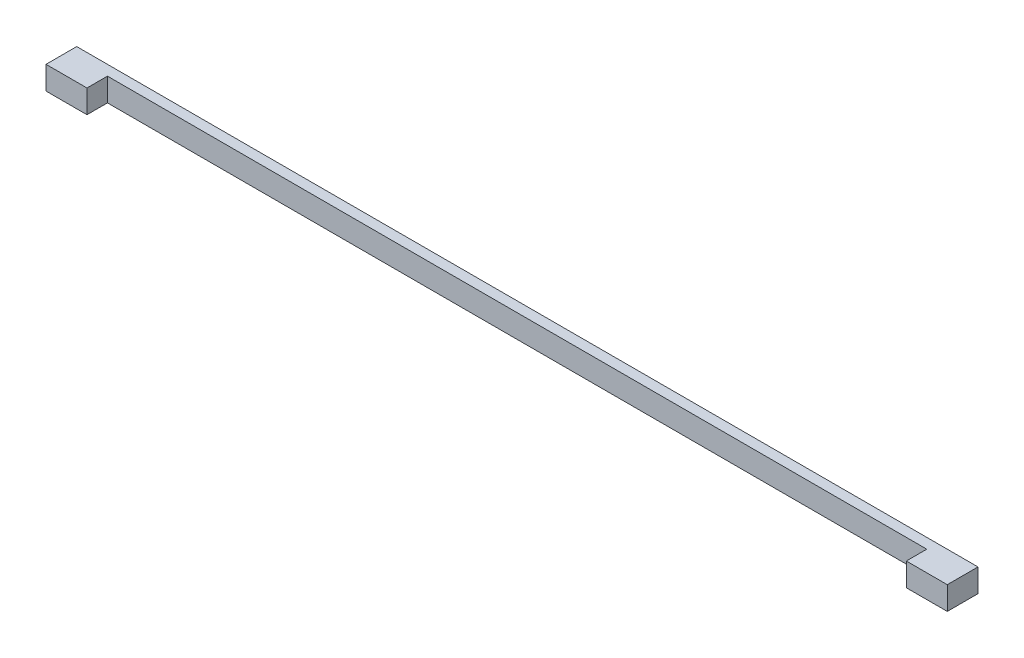
ISO-10303-21;
HEADER;
FILE_DESCRIPTION(('STEP AP214'),'2;1');
FILE_NAME('part.step','',(''),(''),'','','');
FILE_SCHEMA(('AUTOMOTIVE_DESIGN { 1 0 10303 214 1 1 1 1 }'));
ENDSEC;
DATA;
#1=APPLICATION_CONTEXT('core data for automotive mechanical design processes');
#2=APPLICATION_PROTOCOL_DEFINITION('international standard','automotive_design',2000,#1);
#3=PRODUCT_CONTEXT('',#1,'mechanical');
#4=PRODUCT('Part','Part','',(#3));
#5=PRODUCT_RELATED_PRODUCT_CATEGORY('part','',(#4));
#6=PRODUCT_DEFINITION_FORMATION('','',#4);
#7=PRODUCT_DEFINITION_CONTEXT('part definition',#1,'design');
#8=PRODUCT_DEFINITION('design','',#6,#7);
#9=PRODUCT_DEFINITION_SHAPE('','',#8);
#10=(LENGTH_UNIT() NAMED_UNIT(*) SI_UNIT(.MILLI.,.METRE.));
#11=(NAMED_UNIT(*) PLANE_ANGLE_UNIT() SI_UNIT($,.RADIAN.));
#12=(NAMED_UNIT(*) SI_UNIT($,.STERADIAN.) SOLID_ANGLE_UNIT());
#13=UNCERTAINTY_MEASURE_WITH_UNIT(LENGTH_MEASURE(1.E-05),#10,'distance_accuracy_value','');
#14=(GEOMETRIC_REPRESENTATION_CONTEXT(3) GLOBAL_UNCERTAINTY_ASSIGNED_CONTEXT((#13)) GLOBAL_UNIT_ASSIGNED_CONTEXT((#10,
#11,#12)) REPRESENTATION_CONTEXT('',''));
#15=CARTESIAN_POINT('',(0.,0.,0.));
#16=DIRECTION('',(0.,0.,1.));
#17=DIRECTION('',(1.,0.,0.));
#18=AXIS2_PLACEMENT_3D('',#15,#16,#17);
#19=CARTESIAN_POINT('',(0.,0.,5.));
#20=DIRECTION('',(0.,0.,1.));
#21=DIRECTION('',(1.,0.,0.));
#22=AXIS2_PLACEMENT_3D('',#19,#20,#21);
#23=PLANE('',#22);
#24=DIRECTION('',(1.,0.,0.));
#25=VECTOR('',#24,1.);
#26=CARTESIAN_POINT('',(-220.,-5.66011176625891,5.));
#27=LINE('',#26,#25);
#28=CARTESIAN_POINT('',(-200.,-5.66011176625891,5.));
#29=VERTEX_POINT('',#28);
#30=CARTESIAN_POINT('',(200.,-5.66011176625891,5.));
#31=VERTEX_POINT('',#30);
#32=EDGE_CURVE('E64',#29,#31,#27,.T.);
#33=ORIENTED_EDGE('',*,*,#32,.T.);
#34=DIRECTION('',(0.,-1.,0.));
#35=VECTOR('',#34,1.);
#36=CARTESIAN_POINT('',(200.,5.66011176625891,5.));
#37=LINE('',#36,#35);
#38=CARTESIAN_POINT('',(200.,5.66011176625891,5.));
#39=VERTEX_POINT('',#38);
#40=EDGE_CURVE('E59',#39,#31,#37,.T.);
#41=ORIENTED_EDGE('',*,*,#40,.F.);
#42=DIRECTION('',(-1.,0.,0.));
#43=VECTOR('',#42,1.);
#44=CARTESIAN_POINT('',(-220.,5.66011176625891,5.));
#45=LINE('',#44,#43);
#46=CARTESIAN_POINT('',(-200.,5.66011176625891,5.));
#47=VERTEX_POINT('',#46);
#48=EDGE_CURVE('E169',#39,#47,#45,.T.);
#49=ORIENTED_EDGE('',*,*,#48,.T.);
#50=DIRECTION('',(0.,1.,0.));
#51=VECTOR('',#50,1.);
#52=CARTESIAN_POINT('',(-200.,-5.66011176625891,5.));
#53=LINE('',#52,#51);
#54=EDGE_CURVE('E138',#29,#47,#53,.T.);
#55=ORIENTED_EDGE('',*,*,#54,.F.);
#56=EDGE_LOOP('',(#33,#41,#49,#55));
#57=FACE_BOUND('',#56,.T.);
#58=ADVANCED_FACE('F43',(#57),#23,.T.);
#59=CARTESIAN_POINT('',(220.,5.66011176625891,5.));
#60=DIRECTION('',(-1.,0.,0.));
#61=DIRECTION('',(0.,0.,1.));
#62=AXIS2_PLACEMENT_3D('',#59,#60,#61);
#63=PLANE('',#62);
#64=DIRECTION('',(0.,1.,0.));
#65=VECTOR('',#64,1.);
#66=CARTESIAN_POINT('',(220.,5.66011176625891,0.));
#67=LINE('',#66,#65);
#68=CARTESIAN_POINT('',(220.,-5.66011176625891,0.));
#69=VERTEX_POINT('',#68);
#70=CARTESIAN_POINT('',(220.,5.66011176625891,0.));
#71=VERTEX_POINT('',#70);
#72=EDGE_CURVE('E168',#69,#71,#67,.T.);
#73=ORIENTED_EDGE('',*,*,#72,.T.);
#74=DIRECTION('',(0.,0.,-1.));
#75=VECTOR('',#74,1.);
#76=CARTESIAN_POINT('',(220.,5.66011176625891,5.));
#77=LINE('',#76,#75);
#78=CARTESIAN_POINT('',(220.,5.66011176625891,15.));
#79=VERTEX_POINT('',#78);
#80=EDGE_CURVE('E11',#79,#71,#77,.T.);
#81=ORIENTED_EDGE('',*,*,#80,.F.);
#82=DIRECTION('',(0.,1.,0.));
#83=VECTOR('',#82,1.);
#84=CARTESIAN_POINT('',(220.,5.66011176625891,15.));
#85=LINE('',#84,#83);
#86=CARTESIAN_POINT('',(220.,-5.66011176625891,15.));
#87=VERTEX_POINT('',#86);
#88=EDGE_CURVE('E125',#87,#79,#85,.T.);
#89=ORIENTED_EDGE('',*,*,#88,.F.);
#90=DIRECTION('',(0.,0.,-1.));
#91=VECTOR('',#90,1.);
#92=CARTESIAN_POINT('',(220.,-5.66011176625891,5.));
#93=LINE('',#92,#91);
#94=EDGE_CURVE('E107',#87,#69,#93,.T.);
#95=ORIENTED_EDGE('',*,*,#94,.T.);
#96=EDGE_LOOP('',(#73,#81,#89,#95));
#97=FACE_BOUND('',#96,.T.);
#98=ADVANCED_FACE('F45',(#97),#63,.F.);
#99=CARTESIAN_POINT('',(-220.,5.66011176625891,5.));
#100=DIRECTION('',(0.,-1.,0.));
#101=DIRECTION('',(0.,0.,-1.));
#102=AXIS2_PLACEMENT_3D('',#99,#100,#101);
#103=PLANE('',#102);
#104=DIRECTION('',(-1.,0.,0.));
#105=VECTOR('',#104,1.);
#106=CARTESIAN_POINT('',(-220.,5.66011176625891,0.));
#107=LINE('',#106,#105);
#108=CARTESIAN_POINT('',(-220.,5.66011176625891,0.));
#109=VERTEX_POINT('',#108);
#110=EDGE_CURVE('E176',#71,#109,#107,.T.);
#111=ORIENTED_EDGE('',*,*,#110,.T.);
#112=DIRECTION('',(0.,0.,-1.));
#113=VECTOR('',#112,1.);
#114=CARTESIAN_POINT('',(-220.,5.66011176625891,5.));
#115=LINE('',#114,#113);
#116=CARTESIAN_POINT('',(-220.,5.66011176625891,15.));
#117=VERTEX_POINT('',#116);
#118=EDGE_CURVE('E52',#117,#109,#115,.T.);
#119=ORIENTED_EDGE('',*,*,#118,.F.);
#120=DIRECTION('',(-1.,0.,0.));
#121=VECTOR('',#120,1.);
#122=CARTESIAN_POINT('',(-220.,5.66011176625891,15.));
#123=LINE('',#122,#121);
#124=CARTESIAN_POINT('',(-200.,5.66011176625891,15.));
#125=VERTEX_POINT('',#124);
#126=EDGE_CURVE('E153',#125,#117,#123,.T.);
#127=ORIENTED_EDGE('',*,*,#126,.F.);
#128=DIRECTION('',(0.,0.,-1.));
#129=VECTOR('',#128,1.);
#130=CARTESIAN_POINT('',(-200.,5.66011176625891,15.));
#131=LINE('',#130,#129);
#132=EDGE_CURVE('E157',#125,#47,#131,.T.);
#133=ORIENTED_EDGE('',*,*,#132,.T.);
#134=ORIENTED_EDGE('',*,*,#48,.F.);
#135=DIRECTION('',(0.,0.,-1.));
#136=VECTOR('',#135,1.);
#137=CARTESIAN_POINT('',(200.,5.66011176625891,15.));
#138=LINE('',#137,#136);
#139=CARTESIAN_POINT('',(200.,5.66011176625891,15.));
#140=VERTEX_POINT('',#139);
#141=EDGE_CURVE('E198',#140,#39,#138,.T.);
#142=ORIENTED_EDGE('',*,*,#141,.F.);
#143=DIRECTION('',(-1.,0.,0.));
#144=VECTOR('',#143,1.);
#145=CARTESIAN_POINT('',(220.,5.66011176625891,15.));
#146=LINE('',#145,#144);
#147=EDGE_CURVE('E134',#79,#140,#146,.T.);
#148=ORIENTED_EDGE('',*,*,#147,.F.);
#149=ORIENTED_EDGE('',*,*,#80,.T.);
#150=EDGE_LOOP('',(#111,#119,#127,#133,#134,#142,#148,#149));
#151=FACE_BOUND('',#150,.T.);
#152=ADVANCED_FACE('F195',(#151),#103,.F.);
#153=CARTESIAN_POINT('',(-220.,5.66011176625891,5.));
#154=DIRECTION('',(1.,0.,0.));
#155=DIRECTION('',(0.,0.,-1.));
#156=AXIS2_PLACEMENT_3D('',#153,#154,#155);
#157=PLANE('',#156);
#158=DIRECTION('',(0.,-1.,0.));
#159=VECTOR('',#158,1.);
#160=CARTESIAN_POINT('',(-220.,5.66011176625891,0.));
#161=LINE('',#160,#159);
#162=CARTESIAN_POINT('',(-220.,-5.66011176625891,0.));
#163=VERTEX_POINT('',#162);
#164=EDGE_CURVE('E179',#109,#163,#161,.T.);
#165=ORIENTED_EDGE('',*,*,#164,.T.);
#166=DIRECTION('',(0.,0.,-1.));
#167=VECTOR('',#166,1.);
#168=CARTESIAN_POINT('',(-220.,-5.66011176625891,5.));
#169=LINE('',#168,#167);
#170=CARTESIAN_POINT('',(-220.,-5.66011176625891,15.));
#171=VERTEX_POINT('',#170);
#172=EDGE_CURVE('E120',#171,#163,#169,.T.);
#173=ORIENTED_EDGE('',*,*,#172,.F.);
#174=DIRECTION('',(0.,-1.,0.));
#175=VECTOR('',#174,1.);
#176=CARTESIAN_POINT('',(-220.,-5.66011176625891,15.));
#177=LINE('',#176,#175);
#178=EDGE_CURVE('E143',#117,#171,#177,.T.);
#179=ORIENTED_EDGE('',*,*,#178,.F.);
#180=ORIENTED_EDGE('',*,*,#118,.T.);
#181=EDGE_LOOP('',(#165,#173,#179,#180));
#182=FACE_BOUND('',#181,.T.);
#183=ADVANCED_FACE('F190',(#182),#157,.F.);
#184=CARTESIAN_POINT('',(-220.,-5.66011176625891,5.));
#185=DIRECTION('',(0.,1.,0.));
#186=DIRECTION('',(0.,0.,1.));
#187=AXIS2_PLACEMENT_3D('',#184,#185,#186);
#188=PLANE('',#187);
#189=DIRECTION('',(1.,0.,0.));
#190=VECTOR('',#189,1.);
#191=CARTESIAN_POINT('',(-220.,-5.66011176625891,0.));
#192=LINE('',#191,#190);
#193=EDGE_CURVE('E114',#163,#69,#192,.T.);
#194=ORIENTED_EDGE('',*,*,#193,.T.);
#195=ORIENTED_EDGE('',*,*,#94,.F.);
#196=DIRECTION('',(1.,0.,0.));
#197=VECTOR('',#196,1.);
#198=CARTESIAN_POINT('',(220.,-5.66011176625891,15.));
#199=LINE('',#198,#197);
#200=CARTESIAN_POINT('',(200.,-5.66011176625891,15.));
#201=VERTEX_POINT('',#200);
#202=EDGE_CURVE('E111',#201,#87,#199,.T.);
#203=ORIENTED_EDGE('',*,*,#202,.F.);
#204=DIRECTION('',(0.,0.,-1.));
#205=VECTOR('',#204,1.);
#206=CARTESIAN_POINT('',(200.,-5.66011176625891,15.));
#207=LINE('',#206,#205);
#208=EDGE_CURVE('E130',#201,#31,#207,.T.);
#209=ORIENTED_EDGE('',*,*,#208,.T.);
#210=ORIENTED_EDGE('',*,*,#32,.F.);
#211=DIRECTION('',(0.,0.,-1.));
#212=VECTOR('',#211,1.);
#213=CARTESIAN_POINT('',(-200.,-5.66011176625891,15.));
#214=LINE('',#213,#212);
#215=CARTESIAN_POINT('',(-200.,-5.66011176625891,15.));
#216=VERTEX_POINT('',#215);
#217=EDGE_CURVE('E164',#216,#29,#214,.T.);
#218=ORIENTED_EDGE('',*,*,#217,.F.);
#219=DIRECTION('',(1.,0.,0.));
#220=VECTOR('',#219,1.);
#221=CARTESIAN_POINT('',(-220.,-5.66011176625891,15.));
#222=LINE('',#221,#220);
#223=EDGE_CURVE('E147',#171,#216,#222,.T.);
#224=ORIENTED_EDGE('',*,*,#223,.F.);
#225=ORIENTED_EDGE('',*,*,#172,.T.);
#226=EDGE_LOOP('',(#194,#195,#203,#209,#210,#218,#224,#225));
#227=FACE_BOUND('',#226,.T.);
#228=ADVANCED_FACE('F109',(#227),#188,.F.);
#229=CARTESIAN_POINT('',(0.,0.,0.));
#230=DIRECTION('',(0.,0.,1.));
#231=DIRECTION('',(1.,0.,0.));
#232=AXIS2_PLACEMENT_3D('',#229,#230,#231);
#233=PLANE('',#232);
#234=ORIENTED_EDGE('',*,*,#72,.F.);
#235=ORIENTED_EDGE('',*,*,#193,.F.);
#236=ORIENTED_EDGE('',*,*,#164,.F.);
#237=ORIENTED_EDGE('',*,*,#110,.F.);
#238=EDGE_LOOP('',(#234,#235,#236,#237));
#239=FACE_BOUND('',#238,.T.);
#240=ADVANCED_FACE('F194',(#239),#233,.F.);
#241=CARTESIAN_POINT('',(-200.,-5.66011176625891,15.));
#242=DIRECTION('',(-1.,0.,0.));
#243=DIRECTION('',(0.,0.,1.));
#244=AXIS2_PLACEMENT_3D('',#241,#242,#243);
#245=PLANE('',#244);
#246=ORIENTED_EDGE('',*,*,#54,.T.);
#247=ORIENTED_EDGE('',*,*,#132,.F.);
#248=DIRECTION('',(0.,1.,0.));
#249=VECTOR('',#248,1.);
#250=CARTESIAN_POINT('',(-200.,-5.66011176625891,15.));
#251=LINE('',#250,#249);
#252=EDGE_CURVE('E150',#216,#125,#251,.T.);
#253=ORIENTED_EDGE('',*,*,#252,.F.);
#254=ORIENTED_EDGE('',*,*,#217,.T.);
#255=EDGE_LOOP('',(#246,#247,#253,#254));
#256=FACE_BOUND('',#255,.T.);
#257=ADVANCED_FACE('F210',(#256),#245,.F.);
#258=CARTESIAN_POINT('',(0.,0.,15.));
#259=DIRECTION('',(0.,0.,-1.));
#260=DIRECTION('',(-1.,0.,0.));
#261=AXIS2_PLACEMENT_3D('',#258,#259,#260);
#262=PLANE('',#261);
#263=ORIENTED_EDGE('',*,*,#178,.T.);
#264=ORIENTED_EDGE('',*,*,#223,.T.);
#265=ORIENTED_EDGE('',*,*,#252,.T.);
#266=ORIENTED_EDGE('',*,*,#126,.T.);
#267=EDGE_LOOP('',(#263,#264,#265,#266));
#268=FACE_BOUND('',#267,.T.);
#269=ADVANCED_FACE('F213',(#268),#262,.F.);
#270=CARTESIAN_POINT('',(200.,5.66011176625891,15.));
#271=DIRECTION('',(1.,0.,0.));
#272=DIRECTION('',(0.,1.,0.));
#273=AXIS2_PLACEMENT_3D('',#270,#271,#272);
#274=PLANE('',#273);
#275=ORIENTED_EDGE('',*,*,#40,.T.);
#276=ORIENTED_EDGE('',*,*,#208,.F.);
#277=DIRECTION('',(0.,-1.,0.));
#278=VECTOR('',#277,1.);
#279=CARTESIAN_POINT('',(200.,5.66011176625891,15.));
#280=LINE('',#279,#278);
#281=EDGE_CURVE('E127',#140,#201,#280,.T.);
#282=ORIENTED_EDGE('',*,*,#281,.F.);
#283=ORIENTED_EDGE('',*,*,#141,.T.);
#284=EDGE_LOOP('',(#275,#276,#282,#283));
#285=FACE_BOUND('',#284,.T.);
#286=ADVANCED_FACE('F202',(#285),#274,.F.);
#287=CARTESIAN_POINT('',(0.,0.,15.));
#288=DIRECTION('',(0.,0.,-1.));
#289=DIRECTION('',(-1.,0.,0.));
#290=AXIS2_PLACEMENT_3D('',#287,#288,#289);
#291=PLANE('',#290);
#292=ORIENTED_EDGE('',*,*,#88,.T.);
#293=ORIENTED_EDGE('',*,*,#147,.T.);
#294=ORIENTED_EDGE('',*,*,#281,.T.);
#295=ORIENTED_EDGE('',*,*,#202,.T.);
#296=EDGE_LOOP('',(#292,#293,#294,#295));
#297=FACE_BOUND('',#296,.T.);
#298=ADVANCED_FACE('F124',(#297),#291,.F.);
#299=CLOSED_SHELL('',(#58,#98,#152,#183,#228,#240,#257,#269,#286,#298));
#300=MANIFOLD_SOLID_BREP('B2',#299);
#301=ADVANCED_BREP_SHAPE_REPRESENTATION('',(#18,#300),#14);
#302=SHAPE_DEFINITION_REPRESENTATION(#9,#301);
ENDSEC;
END-ISO-10303-21;
